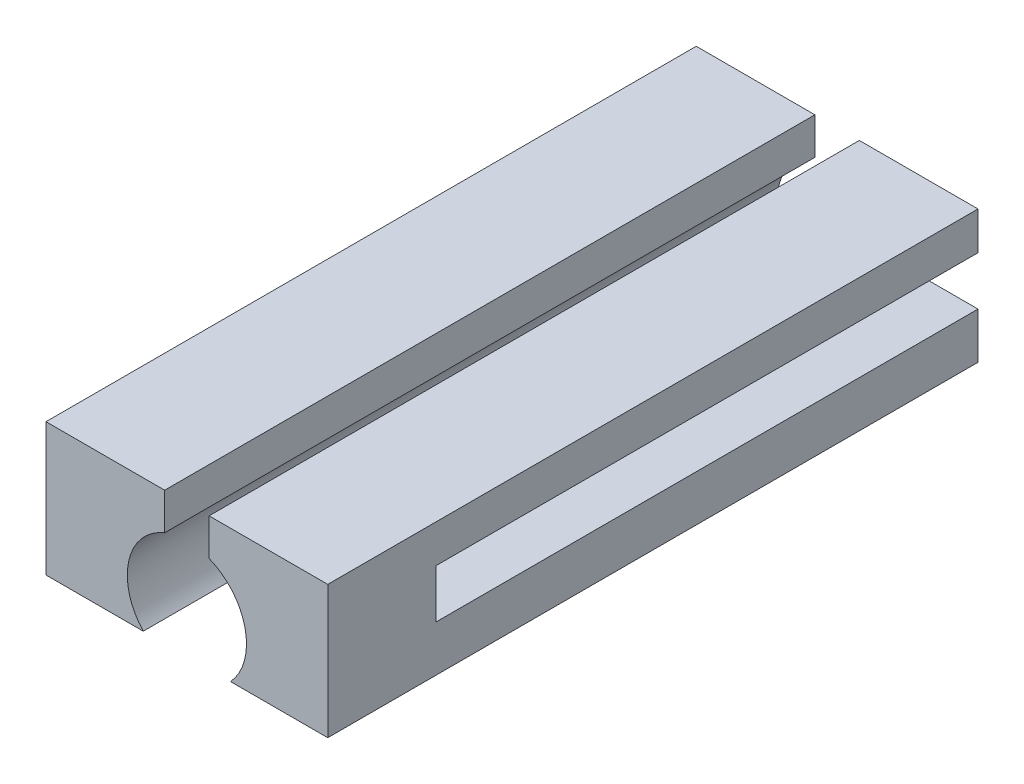
ISO-10303-21;
HEADER;
FILE_DESCRIPTION(('STEP AP214'),'2;1');
FILE_NAME('part.step','',(''),(''),'','','');
FILE_SCHEMA(('AUTOMOTIVE_DESIGN { 1 0 10303 214 1 1 1 1 }'));
ENDSEC;
DATA;
#1=APPLICATION_CONTEXT('core data for automotive mechanical design processes');
#2=APPLICATION_PROTOCOL_DEFINITION('international standard','automotive_design',2000,#1);
#3=PRODUCT_CONTEXT('',#1,'mechanical');
#4=PRODUCT('Part','Part','',(#3));
#5=PRODUCT_RELATED_PRODUCT_CATEGORY('part','',(#4));
#6=PRODUCT_DEFINITION_FORMATION('','',#4);
#7=PRODUCT_DEFINITION_CONTEXT('part definition',#1,'design');
#8=PRODUCT_DEFINITION('design','',#6,#7);
#9=PRODUCT_DEFINITION_SHAPE('','',#8);
#10=(LENGTH_UNIT() NAMED_UNIT(*) SI_UNIT(.MILLI.,.METRE.));
#11=(NAMED_UNIT(*) PLANE_ANGLE_UNIT() SI_UNIT($,.RADIAN.));
#12=(NAMED_UNIT(*) SI_UNIT($,.STERADIAN.) SOLID_ANGLE_UNIT());
#13=UNCERTAINTY_MEASURE_WITH_UNIT(LENGTH_MEASURE(1.E-05),#10,'distance_accuracy_value','');
#14=(GEOMETRIC_REPRESENTATION_CONTEXT(3) GLOBAL_UNCERTAINTY_ASSIGNED_CONTEXT((#13)) GLOBAL_UNIT_ASSIGNED_CONTEXT((#10,
#11,#12)) REPRESENTATION_CONTEXT('',''));
#15=CARTESIAN_POINT('',(0.,0.,0.));
#16=DIRECTION('',(0.,0.,1.));
#17=DIRECTION('',(1.,0.,0.));
#18=AXIS2_PLACEMENT_3D('',#15,#16,#17);
#19=CARTESIAN_POINT('',(0.,0.,-60.));
#20=DIRECTION('',(0.,0.,1.));
#21=DIRECTION('',(-1.,0.,0.));
#22=AXIS2_PLACEMENT_3D('',#19,#20,#21);
#23=PLANE('',#22);
#24=DIRECTION('',(1.,0.,0.));
#25=VECTOR('',#24,1.);
#26=CARTESIAN_POINT('',(0.,1.0129362545094,-60.));
#27=LINE('',#26,#25);
#28=CARTESIAN_POINT('',(16.3664684091374,1.0129362545094,-60.));
#29=VERTEX_POINT('',#28);
#30=CARTESIAN_POINT('',(26.,1.0129362545094,-60.));
#31=VERTEX_POINT('',#30);
#32=EDGE_CURVE('E164',#29,#31,#27,.T.);
#33=ORIENTED_EDGE('',*,*,#32,.T.);
#34=DIRECTION('',(0.,-1.,0.));
#35=VECTOR('',#34,1.);
#36=CARTESIAN_POINT('',(26.,0.,-60.));
#37=LINE('',#36,#35);
#38=CARTESIAN_POINT('',(26.,-7.5,-60.));
#39=VERTEX_POINT('',#38);
#40=EDGE_CURVE('E222',#31,#39,#37,.T.);
#41=ORIENTED_EDGE('',*,*,#40,.T.);
#42=DIRECTION('',(-1.,0.,0.));
#43=VECTOR('',#42,1.);
#44=CARTESIAN_POINT('',(0.,-7.5,-60.));
#45=LINE('',#44,#43);
#46=CARTESIAN_POINT('',(8.04673846971554,-7.5,-60.));
#47=VERTEX_POINT('',#46);
#48=EDGE_CURVE('E226',#39,#47,#45,.T.);
#49=ORIENTED_EDGE('',*,*,#48,.T.);
#50=CARTESIAN_POINT('',(0.,0.,-60.));
#51=DIRECTION('',(0.,0.,-1.));
#52=DIRECTION('',(-1.,0.,0.));
#53=AXIS2_PLACEMENT_3D('',#50,#51,#52);
#54=CIRCLE('',#53,11.);
#55=CARTESIAN_POINT('',(4.10000000000001,10.2073502928037,-60.));
#56=VERTEX_POINT('',#55);
#57=EDGE_CURVE('E238',#56,#47,#54,.T.);
#58=ORIENTED_EDGE('',*,*,#57,.F.);
#59=DIRECTION('',(0.,-1.,0.));
#60=VECTOR('',#59,1.);
#61=CARTESIAN_POINT('',(4.10000000000001,0.,-60.));
#62=LINE('',#61,#60);
#63=CARTESIAN_POINT('',(4.10000000000001,17.0129362545094,-60.));
#64=VERTEX_POINT('',#63);
#65=EDGE_CURVE('E230',#64,#56,#62,.T.);
#66=ORIENTED_EDGE('',*,*,#65,.F.);
#67=DIRECTION('',(-1.,0.,0.));
#68=VECTOR('',#67,1.);
#69=CARTESIAN_POINT('',(0.,17.0129362545094,-60.));
#70=LINE('',#69,#68);
#71=CARTESIAN_POINT('',(26.,17.0129362545094,-60.));
#72=VERTEX_POINT('',#71);
#73=EDGE_CURVE('E215',#72,#64,#70,.T.);
#74=ORIENTED_EDGE('',*,*,#73,.F.);
#75=CARTESIAN_POINT('',(26.,10.0129362545094,-60.));
#76=VERTEX_POINT('',#75);
#77=EDGE_CURVE('E223',#72,#76,#37,.T.);
#78=ORIENTED_EDGE('',*,*,#77,.T.);
#79=DIRECTION('',(-1.,0.,0.));
#80=VECTOR('',#79,1.);
#81=CARTESIAN_POINT('',(0.,10.0129362545094,-60.));
#82=LINE('',#81,#80);
#83=CARTESIAN_POINT('',(16.,10.0129362545094,-60.));
#84=VERTEX_POINT('',#83);
#85=EDGE_CURVE('E171',#76,#84,#82,.T.);
#86=ORIENTED_EDGE('',*,*,#85,.T.);
#87=DIRECTION('',(0.,1.,0.));
#88=VECTOR('',#87,1.);
#89=CARTESIAN_POINT('',(16.,0.,-60.));
#90=LINE('',#89,#88);
#91=CARTESIAN_POINT('',(16.,14.0129362545094,-60.));
#92=VERTEX_POINT('',#91);
#93=EDGE_CURVE('E174',#84,#92,#90,.T.);
#94=ORIENTED_EDGE('',*,*,#93,.T.);
#95=DIRECTION('',(-1.,0.,0.));
#96=VECTOR('',#95,1.);
#97=CARTESIAN_POINT('',(0.,14.0129362545094,-60.));
#98=LINE('',#97,#96);
#99=CARTESIAN_POINT('',(12.5,14.0129362545094,-60.));
#100=VERTEX_POINT('',#99);
#101=EDGE_CURVE('E195',#92,#100,#98,.T.);
#102=ORIENTED_EDGE('',*,*,#101,.T.);
#103=DIRECTION('',(0.,-1.,0.));
#104=VECTOR('',#103,1.);
#105=CARTESIAN_POINT('',(12.5,0.,-60.));
#106=LINE('',#105,#104);
#107=CARTESIAN_POINT('',(12.5,-2.9870637454906,-60.));
#108=VERTEX_POINT('',#107);
#109=EDGE_CURVE('E192',#100,#108,#106,.T.);
#110=ORIENTED_EDGE('',*,*,#109,.T.);
#111=DIRECTION('',(1.,0.,0.));
#112=VECTOR('',#111,1.);
#113=CARTESIAN_POINT('',(0.,-2.9870637454906,-60.));
#114=LINE('',#113,#112);
#115=CARTESIAN_POINT('',(16.3664684091374,-2.9870637454906,-60.));
#116=VERTEX_POINT('',#115);
#117=EDGE_CURVE('E189',#108,#116,#114,.T.);
#118=ORIENTED_EDGE('',*,*,#117,.T.);
#119=DIRECTION('',(0.,1.,0.));
#120=VECTOR('',#119,1.);
#121=CARTESIAN_POINT('',(16.3664684091374,0.,-60.));
#122=LINE('',#121,#120);
#123=EDGE_CURVE('E187',#116,#29,#122,.T.);
#124=ORIENTED_EDGE('',*,*,#123,.T.);
#125=EDGE_LOOP('',(#33,#41,#49,#58,#66,#74,#78,#86,#94,#102,#110,#118,#124));
#126=FACE_BOUND('',#125,.T.);
#127=ADVANCED_FACE('F44',(#126),#23,.F.);
#128=CARTESIAN_POINT('',(26.,0.,60.));
#129=DIRECTION('',(1.,0.,0.));
#130=DIRECTION('',(0.,0.,1.));
#131=AXIS2_PLACEMENT_3D('',#128,#129,#130);
#132=PLANE('',#131);
#133=ORIENTED_EDGE('',*,*,#40,.F.);
#134=DIRECTION('',(0.,0.,-1.));
#135=VECTOR('',#134,1.);
#136=CARTESIAN_POINT('',(26.,1.0129362545094,40.));
#137=LINE('',#136,#135);
#138=CARTESIAN_POINT('',(26.,1.0129362545094,40.));
#139=VERTEX_POINT('',#138);
#140=EDGE_CURVE('E200',#139,#31,#137,.T.);
#141=ORIENTED_EDGE('',*,*,#140,.F.);
#142=DIRECTION('',(0.,-1.,0.));
#143=VECTOR('',#142,1.);
#144=CARTESIAN_POINT('',(26.,0.,40.));
#145=LINE('',#144,#143);
#146=CARTESIAN_POINT('',(26.,10.0129362545094,40.));
#147=VERTEX_POINT('',#146);
#148=EDGE_CURVE('E166',#147,#139,#145,.T.);
#149=ORIENTED_EDGE('',*,*,#148,.F.);
#150=DIRECTION('',(0.,0.,-1.));
#151=VECTOR('',#150,1.);
#152=CARTESIAN_POINT('',(26.,10.0129362545094,40.));
#153=LINE('',#152,#151);
#154=EDGE_CURVE('E203',#147,#76,#153,.T.);
#155=ORIENTED_EDGE('',*,*,#154,.T.);
#156=ORIENTED_EDGE('',*,*,#77,.F.);
#157=DIRECTION('',(0.,0.,1.));
#158=VECTOR('',#157,1.);
#159=CARTESIAN_POINT('',(26.,17.0129362545094,-60.));
#160=LINE('',#159,#158);
#161=CARTESIAN_POINT('',(26.,17.0129362545094,60.));
#162=VERTEX_POINT('',#161);
#163=EDGE_CURVE('E218',#72,#162,#160,.T.);
#164=ORIENTED_EDGE('',*,*,#163,.T.);
#165=DIRECTION('',(0.,1.,0.));
#166=VECTOR('',#165,1.);
#167=CARTESIAN_POINT('',(26.,0.,60.));
#168=LINE('',#167,#166);
#169=CARTESIAN_POINT('',(26.,-7.5,60.));
#170=VERTEX_POINT('',#169);
#171=EDGE_CURVE('E68',#170,#162,#168,.T.);
#172=ORIENTED_EDGE('',*,*,#171,.F.);
#173=DIRECTION('',(0.,0.,-1.));
#174=VECTOR('',#173,1.);
#175=CARTESIAN_POINT('',(26.,-7.5,60.));
#176=LINE('',#175,#174);
#177=EDGE_CURVE('E235',#170,#39,#176,.T.);
#178=ORIENTED_EDGE('',*,*,#177,.T.);
#179=EDGE_LOOP('',(#133,#141,#149,#155,#156,#164,#172,#178));
#180=FACE_BOUND('',#179,.T.);
#181=ADVANCED_FACE('F254',(#180),#132,.T.);
#182=CARTESIAN_POINT('',(0.,-7.5,60.));
#183=DIRECTION('',(0.,1.,0.));
#184=DIRECTION('',(1.,0.,0.));
#185=AXIS2_PLACEMENT_3D('',#182,#183,#184);
#186=PLANE('',#185);
#187=ORIENTED_EDGE('',*,*,#48,.F.);
#188=ORIENTED_EDGE('',*,*,#177,.F.);
#189=DIRECTION('',(-1.,0.,0.));
#190=VECTOR('',#189,1.);
#191=CARTESIAN_POINT('',(0.,-7.5,60.));
#192=LINE('',#191,#190);
#193=CARTESIAN_POINT('',(8.04673846971554,-7.5,60.));
#194=VERTEX_POINT('',#193);
#195=EDGE_CURVE('E227',#170,#194,#192,.T.);
#196=ORIENTED_EDGE('',*,*,#195,.T.);
#197=DIRECTION('',(0.,0.,-1.));
#198=VECTOR('',#197,1.);
#199=CARTESIAN_POINT('',(8.04673846971554,-7.5,60.));
#200=LINE('',#199,#198);
#201=EDGE_CURVE('E12',#194,#47,#200,.T.);
#202=ORIENTED_EDGE('',*,*,#201,.T.);
#203=EDGE_LOOP('',(#187,#188,#196,#202));
#204=FACE_BOUND('',#203,.T.);
#205=ADVANCED_FACE('F46',(#204),#186,.F.);
#206=CARTESIAN_POINT('',(0.,0.,60.));
#207=DIRECTION('',(0.,0.,-1.));
#208=DIRECTION('',(1.,0.,0.));
#209=AXIS2_PLACEMENT_3D('',#206,#207,#208);
#210=CYLINDRICAL_SURFACE('',#209,11.);
#211=ORIENTED_EDGE('',*,*,#57,.T.);
#212=ORIENTED_EDGE('',*,*,#201,.F.);
#213=CARTESIAN_POINT('',(0.,0.,60.));
#214=DIRECTION('',(0.,0.,-1.));
#215=DIRECTION('',(-1.,0.,0.));
#216=AXIS2_PLACEMENT_3D('',#213,#214,#215);
#217=CIRCLE('',#216,11.);
#218=CARTESIAN_POINT('',(4.10000000000001,10.2073502928037,60.));
#219=VERTEX_POINT('',#218);
#220=EDGE_CURVE('E93',#219,#194,#217,.T.);
#221=ORIENTED_EDGE('',*,*,#220,.F.);
#222=DIRECTION('',(0.,0.,-1.));
#223=VECTOR('',#222,1.);
#224=CARTESIAN_POINT('',(4.10000000000001,10.2073502928037,60.));
#225=LINE('',#224,#223);
#226=EDGE_CURVE('E52',#219,#56,#225,.T.);
#227=ORIENTED_EDGE('',*,*,#226,.T.);
#228=EDGE_LOOP('',(#211,#212,#221,#227));
#229=FACE_BOUND('',#228,.T.);
#230=ADVANCED_FACE('F245',(#229),#210,.F.);
#231=CARTESIAN_POINT('',(4.10000000000001,0.,60.));
#232=DIRECTION('',(-1.,0.,0.));
#233=DIRECTION('',(0.,0.,-1.));
#234=AXIS2_PLACEMENT_3D('',#231,#232,#233);
#235=PLANE('',#234);
#236=ORIENTED_EDGE('',*,*,#65,.T.);
#237=ORIENTED_EDGE('',*,*,#226,.F.);
#238=DIRECTION('',(0.,-1.,0.));
#239=VECTOR('',#238,1.);
#240=CARTESIAN_POINT('',(4.10000000000001,0.,60.));
#241=LINE('',#240,#239);
#242=CARTESIAN_POINT('',(4.10000000000001,17.0129362545094,60.));
#243=VERTEX_POINT('',#242);
#244=EDGE_CURVE('E232',#243,#219,#241,.T.);
#245=ORIENTED_EDGE('',*,*,#244,.F.);
#246=DIRECTION('',(0.,0.,-1.));
#247=VECTOR('',#246,1.);
#248=CARTESIAN_POINT('',(4.10000000000001,17.0129362545094,60.));
#249=LINE('',#248,#247);
#250=EDGE_CURVE('E86',#243,#64,#249,.T.);
#251=ORIENTED_EDGE('',*,*,#250,.T.);
#252=EDGE_LOOP('',(#236,#237,#245,#251));
#253=FACE_BOUND('',#252,.T.);
#254=ADVANCED_FACE('F247',(#253),#235,.T.);
#255=CARTESIAN_POINT('',(0.,0.,60.));
#256=DIRECTION('',(0.,0.,1.));
#257=DIRECTION('',(-1.,0.,0.));
#258=AXIS2_PLACEMENT_3D('',#255,#256,#257);
#259=PLANE('',#258);
#260=DIRECTION('',(-1.,0.,0.));
#261=VECTOR('',#260,1.);
#262=CARTESIAN_POINT('',(0.,17.0129362545094,60.));
#263=LINE('',#262,#261);
#264=EDGE_CURVE('E202',#162,#243,#263,.T.);
#265=ORIENTED_EDGE('',*,*,#264,.T.);
#266=ORIENTED_EDGE('',*,*,#244,.T.);
#267=ORIENTED_EDGE('',*,*,#220,.T.);
#268=ORIENTED_EDGE('',*,*,#195,.F.);
#269=ORIENTED_EDGE('',*,*,#171,.T.);
#270=EDGE_LOOP('',(#265,#266,#267,#268,#269));
#271=FACE_BOUND('',#270,.T.);
#272=ADVANCED_FACE('F279',(#271),#259,.T.);
#273=CARTESIAN_POINT('',(0.,17.0129362545094,-60.));
#274=DIRECTION('',(0.,1.,0.));
#275=DIRECTION('',(0.,0.,1.));
#276=AXIS2_PLACEMENT_3D('',#273,#274,#275);
#277=PLANE('',#276);
#278=ORIENTED_EDGE('',*,*,#264,.F.);
#279=ORIENTED_EDGE('',*,*,#163,.F.);
#280=ORIENTED_EDGE('',*,*,#73,.T.);
#281=ORIENTED_EDGE('',*,*,#250,.F.);
#282=EDGE_LOOP('',(#278,#279,#280,#281));
#283=FACE_BOUND('',#282,.T.);
#284=ADVANCED_FACE('F278',(#283),#277,.T.);
#285=CARTESIAN_POINT('',(0.,1.0129362545094,40.));
#286=DIRECTION('',(0.,1.,0.));
#287=DIRECTION('',(-1.,0.,0.));
#288=AXIS2_PLACEMENT_3D('',#285,#286,#287);
#289=PLANE('',#288);
#290=ORIENTED_EDGE('',*,*,#32,.F.);
#291=DIRECTION('',(0.,0.,-1.));
#292=VECTOR('',#291,1.);
#293=CARTESIAN_POINT('',(16.3664684091374,1.0129362545094,40.));
#294=LINE('',#293,#292);
#295=CARTESIAN_POINT('',(16.3664684091374,1.0129362545094,40.));
#296=VERTEX_POINT('',#295);
#297=EDGE_CURVE('E153',#296,#29,#294,.T.);
#298=ORIENTED_EDGE('',*,*,#297,.F.);
#299=DIRECTION('',(1.,0.,0.));
#300=VECTOR('',#299,1.);
#301=CARTESIAN_POINT('',(0.,1.0129362545094,40.));
#302=LINE('',#301,#300);
#303=EDGE_CURVE('E159',#296,#139,#302,.T.);
#304=ORIENTED_EDGE('',*,*,#303,.T.);
#305=ORIENTED_EDGE('',*,*,#140,.T.);
#306=EDGE_LOOP('',(#290,#298,#304,#305));
#307=FACE_BOUND('',#306,.T.);
#308=ADVANCED_FACE('F162',(#307),#289,.T.);
#309=CARTESIAN_POINT('',(0.,10.0129362545094,40.));
#310=DIRECTION('',(0.,-1.,0.));
#311=DIRECTION('',(0.,0.,-1.));
#312=AXIS2_PLACEMENT_3D('',#309,#310,#311);
#313=PLANE('',#312);
#314=ORIENTED_EDGE('',*,*,#85,.F.);
#315=ORIENTED_EDGE('',*,*,#154,.F.);
#316=DIRECTION('',(-1.,0.,0.));
#317=VECTOR('',#316,1.);
#318=CARTESIAN_POINT('',(0.,10.0129362545094,40.));
#319=LINE('',#318,#317);
#320=CARTESIAN_POINT('',(16.,10.0129362545094,40.));
#321=VERTEX_POINT('',#320);
#322=EDGE_CURVE('E59',#147,#321,#319,.T.);
#323=ORIENTED_EDGE('',*,*,#322,.T.);
#324=DIRECTION('',(0.,0.,-1.));
#325=VECTOR('',#324,1.);
#326=CARTESIAN_POINT('',(16.,10.0129362545094,40.));
#327=LINE('',#326,#325);
#328=EDGE_CURVE('E206',#321,#84,#327,.T.);
#329=ORIENTED_EDGE('',*,*,#328,.T.);
#330=EDGE_LOOP('',(#314,#315,#323,#329));
#331=FACE_BOUND('',#330,.T.);
#332=ADVANCED_FACE('F274',(#331),#313,.T.);
#333=CARTESIAN_POINT('',(16.,0.,40.));
#334=DIRECTION('',(-1.,0.,0.));
#335=DIRECTION('',(0.,0.,1.));
#336=AXIS2_PLACEMENT_3D('',#333,#334,#335);
#337=PLANE('',#336);
#338=ORIENTED_EDGE('',*,*,#93,.F.);
#339=ORIENTED_EDGE('',*,*,#328,.F.);
#340=DIRECTION('',(0.,1.,0.));
#341=VECTOR('',#340,1.);
#342=CARTESIAN_POINT('',(16.,0.,40.));
#343=LINE('',#342,#341);
#344=CARTESIAN_POINT('',(16.,14.0129362545094,40.));
#345=VERTEX_POINT('',#344);
#346=EDGE_CURVE('E182',#321,#345,#343,.T.);
#347=ORIENTED_EDGE('',*,*,#346,.T.);
#348=DIRECTION('',(0.,0.,-1.));
#349=VECTOR('',#348,1.);
#350=CARTESIAN_POINT('',(16.,14.0129362545094,40.));
#351=LINE('',#350,#349);
#352=EDGE_CURVE('E208',#345,#92,#351,.T.);
#353=ORIENTED_EDGE('',*,*,#352,.T.);
#354=EDGE_LOOP('',(#338,#339,#347,#353));
#355=FACE_BOUND('',#354,.T.);
#356=ADVANCED_FACE('F271',(#355),#337,.T.);
#357=CARTESIAN_POINT('',(0.,14.0129362545094,40.));
#358=DIRECTION('',(0.,-1.,0.));
#359=DIRECTION('',(0.,0.,-1.));
#360=AXIS2_PLACEMENT_3D('',#357,#358,#359);
#361=PLANE('',#360);
#362=ORIENTED_EDGE('',*,*,#101,.F.);
#363=ORIENTED_EDGE('',*,*,#352,.F.);
#364=DIRECTION('',(-1.,0.,0.));
#365=VECTOR('',#364,1.);
#366=CARTESIAN_POINT('',(0.,14.0129362545094,40.));
#367=LINE('',#366,#365);
#368=CARTESIAN_POINT('',(12.5,14.0129362545094,40.));
#369=VERTEX_POINT('',#368);
#370=EDGE_CURVE('E180',#345,#369,#367,.T.);
#371=ORIENTED_EDGE('',*,*,#370,.T.);
#372=DIRECTION('',(0.,0.,-1.));
#373=VECTOR('',#372,1.);
#374=CARTESIAN_POINT('',(12.5,14.0129362545094,40.));
#375=LINE('',#374,#373);
#376=EDGE_CURVE('E210',#369,#100,#375,.T.);
#377=ORIENTED_EDGE('',*,*,#376,.T.);
#378=EDGE_LOOP('',(#362,#363,#371,#377));
#379=FACE_BOUND('',#378,.T.);
#380=ADVANCED_FACE('F267',(#379),#361,.T.);
#381=CARTESIAN_POINT('',(12.5,0.,40.));
#382=DIRECTION('',(1.,0.,0.));
#383=DIRECTION('',(0.,1.,0.));
#384=AXIS2_PLACEMENT_3D('',#381,#382,#383);
#385=PLANE('',#384);
#386=ORIENTED_EDGE('',*,*,#109,.F.);
#387=ORIENTED_EDGE('',*,*,#376,.F.);
#388=DIRECTION('',(0.,-1.,0.));
#389=VECTOR('',#388,1.);
#390=CARTESIAN_POINT('',(12.5,0.,40.));
#391=LINE('',#390,#389);
#392=CARTESIAN_POINT('',(12.5,-2.9870637454906,40.));
#393=VERTEX_POINT('',#392);
#394=EDGE_CURVE('E178',#369,#393,#391,.T.);
#395=ORIENTED_EDGE('',*,*,#394,.T.);
#396=DIRECTION('',(0.,0.,-1.));
#397=VECTOR('',#396,1.);
#398=CARTESIAN_POINT('',(12.5,-2.9870637454906,40.));
#399=LINE('',#398,#397);
#400=EDGE_CURVE('E212',#393,#108,#399,.T.);
#401=ORIENTED_EDGE('',*,*,#400,.T.);
#402=EDGE_LOOP('',(#386,#387,#395,#401));
#403=FACE_BOUND('',#402,.T.);
#404=ADVANCED_FACE('F264',(#403),#385,.T.);
#405=CARTESIAN_POINT('',(0.,-2.9870637454906,40.));
#406=DIRECTION('',(0.,1.,0.));
#407=DIRECTION('',(-1.,0.,0.));
#408=AXIS2_PLACEMENT_3D('',#405,#406,#407);
#409=PLANE('',#408);
#410=ORIENTED_EDGE('',*,*,#117,.F.);
#411=ORIENTED_EDGE('',*,*,#400,.F.);
#412=DIRECTION('',(1.,0.,0.));
#413=VECTOR('',#412,1.);
#414=CARTESIAN_POINT('',(0.,-2.9870637454906,40.));
#415=LINE('',#414,#413);
#416=CARTESIAN_POINT('',(16.3664684091374,-2.9870637454906,40.));
#417=VERTEX_POINT('',#416);
#418=EDGE_CURVE('E158',#393,#417,#415,.T.);
#419=ORIENTED_EDGE('',*,*,#418,.T.);
#420=DIRECTION('',(0.,0.,-1.));
#421=VECTOR('',#420,1.);
#422=CARTESIAN_POINT('',(16.3664684091374,-2.9870637454906,40.));
#423=LINE('',#422,#421);
#424=EDGE_CURVE('E155',#417,#116,#423,.T.);
#425=ORIENTED_EDGE('',*,*,#424,.T.);
#426=EDGE_LOOP('',(#410,#411,#419,#425));
#427=FACE_BOUND('',#426,.T.);
#428=ADVANCED_FACE('F259',(#427),#409,.T.);
#429=CARTESIAN_POINT('',(16.3664684091374,0.,40.));
#430=DIRECTION('',(-1.,0.,0.));
#431=DIRECTION('',(0.,0.,1.));
#432=AXIS2_PLACEMENT_3D('',#429,#430,#431);
#433=PLANE('',#432);
#434=ORIENTED_EDGE('',*,*,#123,.F.);
#435=ORIENTED_EDGE('',*,*,#424,.F.);
#436=DIRECTION('',(0.,1.,0.));
#437=VECTOR('',#436,1.);
#438=CARTESIAN_POINT('',(16.3664684091374,0.,40.));
#439=LINE('',#438,#437);
#440=EDGE_CURVE('E149',#417,#296,#439,.T.);
#441=ORIENTED_EDGE('',*,*,#440,.T.);
#442=ORIENTED_EDGE('',*,*,#297,.T.);
#443=EDGE_LOOP('',(#434,#435,#441,#442));
#444=FACE_BOUND('',#443,.T.);
#445=ADVANCED_FACE('F152',(#444),#433,.T.);
#446=CARTESIAN_POINT('',(0.,0.,40.));
#447=DIRECTION('',(0.,0.,-1.));
#448=DIRECTION('',(-1.,0.,0.));
#449=AXIS2_PLACEMENT_3D('',#446,#447,#448);
#450=PLANE('',#449);
#451=ORIENTED_EDGE('',*,*,#303,.F.);
#452=ORIENTED_EDGE('',*,*,#440,.F.);
#453=ORIENTED_EDGE('',*,*,#418,.F.);
#454=ORIENTED_EDGE('',*,*,#394,.F.);
#455=ORIENTED_EDGE('',*,*,#370,.F.);
#456=ORIENTED_EDGE('',*,*,#346,.F.);
#457=ORIENTED_EDGE('',*,*,#322,.F.);
#458=ORIENTED_EDGE('',*,*,#148,.T.);
#459=EDGE_LOOP('',(#451,#452,#453,#454,#455,#456,#457,#458));
#460=FACE_BOUND('',#459,.T.);
#461=ADVANCED_FACE('F168',(#460),#450,.T.);
#462=CLOSED_SHELL('',(#127,#181,#205,#230,#254,#272,#284,#308,#332,#356,#380,#404,#428,#445,#461));
#463=MANIFOLD_SOLID_BREP('B2',#462);
#464=CARTESIAN_POINT('',(0.,0.,-60.));
#465=DIRECTION('',(0.,0.,1.));
#466=DIRECTION('',(1.,0.,0.));
#467=AXIS2_PLACEMENT_3D('',#464,#465,#466);
#468=PLANE('',#467);
#469=DIRECTION('',(1.,0.,0.));
#470=VECTOR('',#469,1.);
#471=CARTESIAN_POINT('',(-26.,17.0129362545094,-60.));
#472=LINE('',#471,#470);
#473=CARTESIAN_POINT('',(-26.,17.0129362545094,-60.));
#474=VERTEX_POINT('',#473);
#475=CARTESIAN_POINT('',(-4.10000000000001,17.0129362545094,-60.));
#476=VERTEX_POINT('',#475);
#477=EDGE_CURVE('E504',#474,#476,#472,.T.);
#478=ORIENTED_EDGE('',*,*,#477,.T.);
#479=DIRECTION('',(0.,-1.,0.));
#480=VECTOR('',#479,1.);
#481=CARTESIAN_POINT('',(-4.10000000000001,0.,-60.));
#482=LINE('',#481,#480);
#483=CARTESIAN_POINT('',(-4.10000000000001,10.2073502928037,-60.));
#484=VERTEX_POINT('',#483);
#485=EDGE_CURVE('E477',#476,#484,#482,.T.);
#486=ORIENTED_EDGE('',*,*,#485,.T.);
#487=CARTESIAN_POINT('',(0.,0.,-60.));
#488=DIRECTION('',(0.,0.,1.));
#489=DIRECTION('',(1.,0.,0.));
#490=AXIS2_PLACEMENT_3D('',#487,#488,#489);
#491=CIRCLE('',#490,11.);
#492=CARTESIAN_POINT('',(-8.04673846971554,-7.5,-60.));
#493=VERTEX_POINT('',#492);
#494=EDGE_CURVE('E489',#484,#493,#491,.T.);
#495=ORIENTED_EDGE('',*,*,#494,.T.);
#496=DIRECTION('',(1.,0.,0.));
#497=VECTOR('',#496,1.);
#498=CARTESIAN_POINT('',(0.,-7.5,-60.));
#499=LINE('',#498,#497);
#500=CARTESIAN_POINT('',(-26.,-7.5,-60.));
#501=VERTEX_POINT('',#500);
#502=EDGE_CURVE('E453',#501,#493,#499,.T.);
#503=ORIENTED_EDGE('',*,*,#502,.F.);
#504=DIRECTION('',(0.,-1.,0.));
#505=VECTOR('',#504,1.);
#506=CARTESIAN_POINT('',(-26.,36.,-60.));
#507=LINE('',#506,#505);
#508=EDGE_CURVE('E490',#474,#501,#507,.T.);
#509=ORIENTED_EDGE('',*,*,#508,.F.);
#510=EDGE_LOOP('',(#478,#486,#495,#503,#509));
#511=FACE_BOUND('',#510,.T.);
#512=ADVANCED_FACE('F424',(#511),#468,.F.);
#513=CARTESIAN_POINT('',(0.,-7.5,60.));
#514=DIRECTION('',(0.,1.,0.));
#515=DIRECTION('',(-1.,0.,0.));
#516=AXIS2_PLACEMENT_3D('',#513,#514,#515);
#517=PLANE('',#516);
#518=DIRECTION('',(0.,0.,-1.));
#519=VECTOR('',#518,1.);
#520=CARTESIAN_POINT('',(-26.,-7.5,60.));
#521=LINE('',#520,#519);
#522=CARTESIAN_POINT('',(-26.,-7.5,60.));
#523=VERTEX_POINT('',#522);
#524=EDGE_CURVE('E441',#523,#501,#521,.T.);
#525=ORIENTED_EDGE('',*,*,#524,.T.);
#526=ORIENTED_EDGE('',*,*,#502,.T.);
#527=DIRECTION('',(0.,0.,-1.));
#528=VECTOR('',#527,1.);
#529=CARTESIAN_POINT('',(-8.04673846971554,-7.5,60.));
#530=LINE('',#529,#528);
#531=CARTESIAN_POINT('',(-8.04673846971554,-7.5,60.));
#532=VERTEX_POINT('',#531);
#533=EDGE_CURVE('E42',#532,#493,#530,.T.);
#534=ORIENTED_EDGE('',*,*,#533,.F.);
#535=DIRECTION('',(1.,0.,0.));
#536=VECTOR('',#535,1.);
#537=CARTESIAN_POINT('',(0.,-7.5,60.));
#538=LINE('',#537,#536);
#539=EDGE_CURVE('E469',#523,#532,#538,.T.);
#540=ORIENTED_EDGE('',*,*,#539,.F.);
#541=EDGE_LOOP('',(#525,#526,#534,#540));
#542=FACE_BOUND('',#541,.T.);
#543=ADVANCED_FACE('F426',(#542),#517,.F.);
#544=CARTESIAN_POINT('',(0.,0.,60.));
#545=DIRECTION('',(0.,0.,-1.));
#546=DIRECTION('',(-1.,0.,0.));
#547=AXIS2_PLACEMENT_3D('',#544,#545,#546);
#548=CYLINDRICAL_SURFACE('',#547,11.);
#549=ORIENTED_EDGE('',*,*,#494,.F.);
#550=DIRECTION('',(0.,0.,-1.));
#551=VECTOR('',#550,1.);
#552=CARTESIAN_POINT('',(-4.10000000000001,10.2073502928037,60.));
#553=LINE('',#552,#551);
#554=CARTESIAN_POINT('',(-4.10000000000001,10.2073502928037,60.));
#555=VERTEX_POINT('',#554);
#556=EDGE_CURVE('E433',#555,#484,#553,.T.);
#557=ORIENTED_EDGE('',*,*,#556,.F.);
#558=CARTESIAN_POINT('',(0.,0.,60.));
#559=DIRECTION('',(0.,0.,1.));
#560=DIRECTION('',(1.,0.,0.));
#561=AXIS2_PLACEMENT_3D('',#558,#559,#560);
#562=CIRCLE('',#561,11.);
#563=EDGE_CURVE('E473',#555,#532,#562,.T.);
#564=ORIENTED_EDGE('',*,*,#563,.T.);
#565=ORIENTED_EDGE('',*,*,#533,.T.);
#566=EDGE_LOOP('',(#549,#557,#564,#565));
#567=FACE_BOUND('',#566,.T.);
#568=ADVANCED_FACE('F481',(#567),#548,.F.);
#569=CARTESIAN_POINT('',(-4.10000000000001,0.,60.));
#570=DIRECTION('',(1.,0.,0.));
#571=DIRECTION('',(0.,0.,-1.));
#572=AXIS2_PLACEMENT_3D('',#569,#570,#571);
#573=PLANE('',#572);
#574=ORIENTED_EDGE('',*,*,#485,.F.);
#575=DIRECTION('',(0.,0.,-1.));
#576=VECTOR('',#575,1.);
#577=CARTESIAN_POINT('',(-4.10000000000001,17.0129362545094,60.));
#578=LINE('',#577,#576);
#579=CARTESIAN_POINT('',(-4.10000000000001,17.0129362545094,60.));
#580=VERTEX_POINT('',#579);
#581=EDGE_CURVE('E495',#580,#476,#578,.T.);
#582=ORIENTED_EDGE('',*,*,#581,.F.);
#583=DIRECTION('',(0.,-1.,0.));
#584=VECTOR('',#583,1.);
#585=CARTESIAN_POINT('',(-4.10000000000001,0.,60.));
#586=LINE('',#585,#584);
#587=EDGE_CURVE('E482',#580,#555,#586,.T.);
#588=ORIENTED_EDGE('',*,*,#587,.T.);
#589=ORIENTED_EDGE('',*,*,#556,.T.);
#590=EDGE_LOOP('',(#574,#582,#588,#589));
#591=FACE_BOUND('',#590,.T.);
#592=ADVANCED_FACE('F499',(#591),#573,.T.);
#593=CARTESIAN_POINT('',(-26.,0.,60.));
#594=DIRECTION('',(-1.,0.,0.));
#595=DIRECTION('',(0.,0.,1.));
#596=AXIS2_PLACEMENT_3D('',#593,#594,#595);
#597=PLANE('',#596);
#598=ORIENTED_EDGE('',*,*,#508,.T.);
#599=ORIENTED_EDGE('',*,*,#524,.F.);
#600=DIRECTION('',(0.,1.,0.));
#601=VECTOR('',#600,1.);
#602=CARTESIAN_POINT('',(-26.,0.,60.));
#603=LINE('',#602,#601);
#604=CARTESIAN_POINT('',(-26.,17.0129362545094,60.));
#605=VERTEX_POINT('',#604);
#606=EDGE_CURVE('E476',#523,#605,#603,.T.);
#607=ORIENTED_EDGE('',*,*,#606,.T.);
#608=DIRECTION('',(0.,0.,1.));
#609=VECTOR('',#608,1.);
#610=CARTESIAN_POINT('',(-26.,17.0129362545094,-60.));
#611=LINE('',#610,#609);
#612=EDGE_CURVE('E509',#474,#605,#611,.T.);
#613=ORIENTED_EDGE('',*,*,#612,.F.);
#614=EDGE_LOOP('',(#598,#599,#607,#613));
#615=FACE_BOUND('',#614,.T.);
#616=ADVANCED_FACE('F516',(#615),#597,.T.);
#617=CARTESIAN_POINT('',(0.,0.,60.));
#618=DIRECTION('',(0.,0.,1.));
#619=DIRECTION('',(1.,0.,0.));
#620=AXIS2_PLACEMENT_3D('',#617,#618,#619);
#621=PLANE('',#620);
#622=ORIENTED_EDGE('',*,*,#587,.F.);
#623=DIRECTION('',(1.,0.,0.));
#624=VECTOR('',#623,1.);
#625=CARTESIAN_POINT('',(-26.,17.0129362545094,60.));
#626=LINE('',#625,#624);
#627=EDGE_CURVE('E508',#605,#580,#626,.T.);
#628=ORIENTED_EDGE('',*,*,#627,.F.);
#629=ORIENTED_EDGE('',*,*,#606,.F.);
#630=ORIENTED_EDGE('',*,*,#539,.T.);
#631=ORIENTED_EDGE('',*,*,#563,.F.);
#632=EDGE_LOOP('',(#622,#628,#629,#630,#631));
#633=FACE_BOUND('',#632,.T.);
#634=ADVANCED_FACE('F471',(#633),#621,.T.);
#635=CARTESIAN_POINT('',(-26.,17.0129362545094,-60.));
#636=DIRECTION('',(0.,-1.,0.));
#637=DIRECTION('',(0.,0.,-1.));
#638=AXIS2_PLACEMENT_3D('',#635,#636,#637);
#639=PLANE('',#638);
#640=ORIENTED_EDGE('',*,*,#627,.T.);
#641=ORIENTED_EDGE('',*,*,#581,.T.);
#642=ORIENTED_EDGE('',*,*,#477,.F.);
#643=ORIENTED_EDGE('',*,*,#612,.T.);
#644=EDGE_LOOP('',(#640,#641,#642,#643));
#645=FACE_BOUND('',#644,.T.);
#646=ADVANCED_FACE('F512',(#645),#639,.F.);
#647=CLOSED_SHELL('',(#512,#543,#568,#592,#616,#634,#646));
#648=MANIFOLD_SOLID_BREP('B6',#647);
#649=ADVANCED_BREP_SHAPE_REPRESENTATION('',(#18,#463,#648),#14);
#650=SHAPE_DEFINITION_REPRESENTATION(#9,#649);
ENDSEC;
END-ISO-10303-21;
